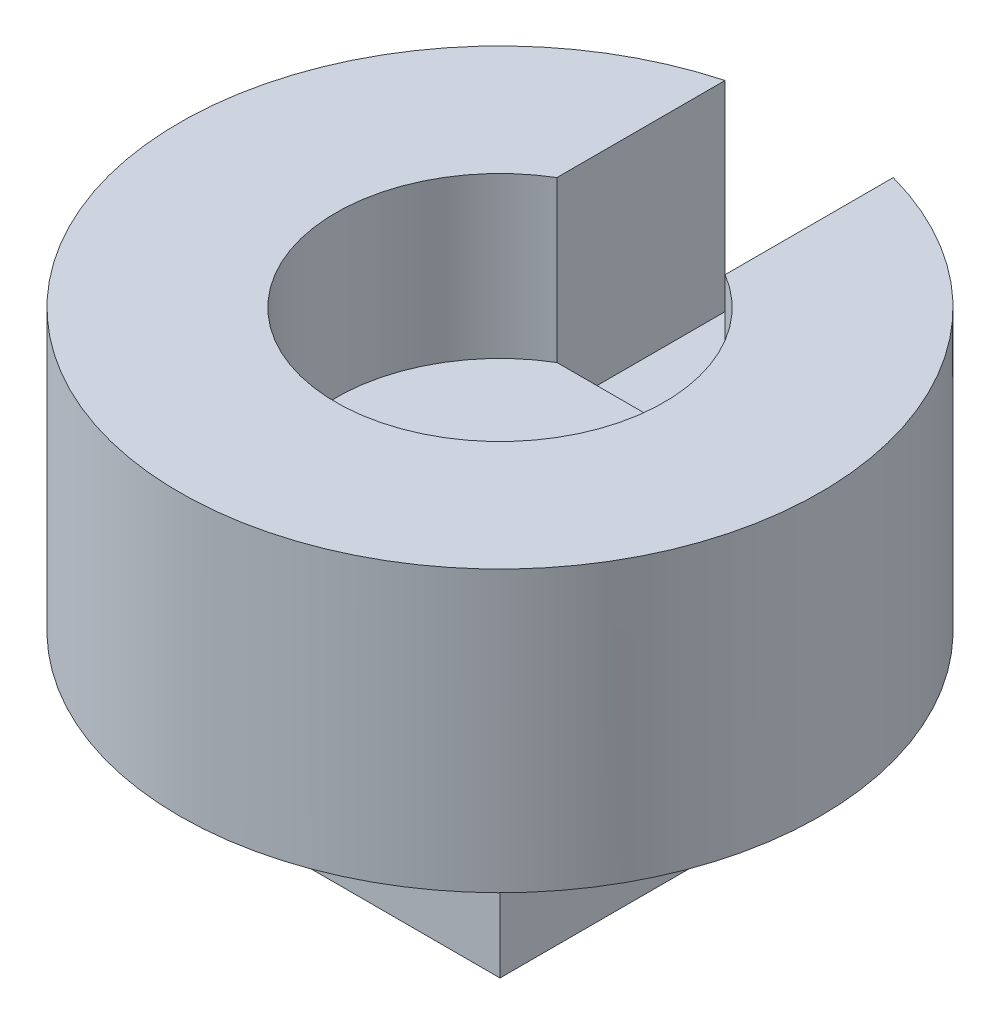
ISO-10303-21;
HEADER;
FILE_DESCRIPTION(('STEP AP214'),'2;1');
FILE_NAME('part.step','',(''),(''),'','','');
FILE_SCHEMA(('AUTOMOTIVE_DESIGN { 1 0 10303 214 1 1 1 1 }'));
ENDSEC;
DATA;
#1=APPLICATION_CONTEXT('core data for automotive mechanical design processes');
#2=APPLICATION_PROTOCOL_DEFINITION('international standard','automotive_design',2000,#1);
#3=PRODUCT_CONTEXT('',#1,'mechanical');
#4=PRODUCT('Part','Part','',(#3));
#5=PRODUCT_RELATED_PRODUCT_CATEGORY('part','',(#4));
#6=PRODUCT_DEFINITION_FORMATION('','',#4);
#7=PRODUCT_DEFINITION_CONTEXT('part definition',#1,'design');
#8=PRODUCT_DEFINITION('design','',#6,#7);
#9=PRODUCT_DEFINITION_SHAPE('','',#8);
#10=(LENGTH_UNIT() NAMED_UNIT(*) SI_UNIT(.MILLI.,.METRE.));
#11=(NAMED_UNIT(*) PLANE_ANGLE_UNIT() SI_UNIT($,.RADIAN.));
#12=(NAMED_UNIT(*) SI_UNIT($,.STERADIAN.) SOLID_ANGLE_UNIT());
#13=UNCERTAINTY_MEASURE_WITH_UNIT(LENGTH_MEASURE(1.E-05),#10,'distance_accuracy_value','');
#14=(GEOMETRIC_REPRESENTATION_CONTEXT(3) GLOBAL_UNCERTAINTY_ASSIGNED_CONTEXT((#13)) GLOBAL_UNIT_ASSIGNED_CONTEXT((#10,
#11,#12)) REPRESENTATION_CONTEXT('',''));
#15=CARTESIAN_POINT('',(0.,0.,0.));
#16=DIRECTION('',(0.,0.,1.));
#17=DIRECTION('',(1.,0.,0.));
#18=AXIS2_PLACEMENT_3D('',#15,#16,#17);
#19=CARTESIAN_POINT('',(0.,6.,0.));
#20=DIRECTION('',(0.,-1.,0.));
#21=DIRECTION('',(0.,0.,-1.));
#22=AXIS2_PLACEMENT_3D('',#19,#20,#21);
#23=CYLINDRICAL_SURFACE('',#22,4.);
#24=DIRECTION('',(0.,1.,0.));
#25=VECTOR('',#24,1.);
#26=CARTESIAN_POINT('',(-1.05,4.,-3.85972796968906));
#27=LINE('',#26,#25);
#28=CARTESIAN_POINT('',(-1.05,3.5,-3.85972796968906));
#29=VERTEX_POINT('',#28);
#30=CARTESIAN_POINT('',(-1.05,6.,-3.85972796968906));
#31=VERTEX_POINT('',#30);
#32=EDGE_CURVE('E163',#29,#31,#27,.T.);
#33=ORIENTED_EDGE('',*,*,#32,.F.);
#34=CARTESIAN_POINT('',(0.,3.5,0.));
#35=DIRECTION('',(0.,1.,0.));
#36=DIRECTION('',(0.,0.,1.));
#37=AXIS2_PLACEMENT_3D('',#34,#35,#36);
#38=CIRCLE('',#37,4.);
#39=CARTESIAN_POINT('',(1.05,3.5,-3.85972796968906));
#40=VERTEX_POINT('',#39);
#41=EDGE_CURVE('E140',#40,#29,#38,.T.);
#42=ORIENTED_EDGE('',*,*,#41,.F.);
#43=DIRECTION('',(0.,1.,0.));
#44=VECTOR('',#43,1.);
#45=CARTESIAN_POINT('',(1.05,4.,-3.85972796968906));
#46=LINE('',#45,#44);
#47=CARTESIAN_POINT('',(1.05,6.,-3.85972796968906));
#48=VERTEX_POINT('',#47);
#49=EDGE_CURVE('E136',#40,#48,#46,.T.);
#50=ORIENTED_EDGE('',*,*,#49,.T.);
#51=CARTESIAN_POINT('',(0.,6.,0.));
#52=DIRECTION('',(0.,1.,0.));
#53=DIRECTION('',(0.,0.,1.));
#54=AXIS2_PLACEMENT_3D('',#51,#52,#53);
#55=CIRCLE('',#54,4.);
#56=EDGE_CURVE('E167',#31,#48,#55,.T.);
#57=ORIENTED_EDGE('',*,*,#56,.F.);
#58=EDGE_LOOP('',(#33,#42,#50,#57));
#59=FACE_BOUND('',#58,.T.);
#60=CARTESIAN_POINT('',(0.,2.5,0.));
#61=DIRECTION('',(0.,1.,0.));
#62=DIRECTION('',(0.,0.,1.));
#63=AXIS2_PLACEMENT_3D('',#60,#61,#62);
#64=CIRCLE('',#63,4.);
#65=CARTESIAN_POINT('',(0.,2.5,4.));
#66=VERTEX_POINT('',#65);
#67=EDGE_CURVE('E162',#66,#66,#64,.T.);
#68=ORIENTED_EDGE('',*,*,#67,.T.);
#69=EDGE_LOOP('',(#68));
#70=FACE_BOUND('',#69,.T.);
#71=ADVANCED_FACE('F38',(#59,#70),#23,.T.);
#72=CARTESIAN_POINT('',(0.,6.,0.));
#73=DIRECTION('',(0.,1.,0.));
#74=DIRECTION('',(0.,0.,1.));
#75=AXIS2_PLACEMENT_3D('',#72,#73,#74);
#76=PLANE('',#75);
#77=CARTESIAN_POINT('',(0.,6.,0.));
#78=DIRECTION('',(0.,1.,0.));
#79=DIRECTION('',(0.,0.,1.));
#80=AXIS2_PLACEMENT_3D('',#77,#78,#79);
#81=CIRCLE('',#80,2.05);
#82=CARTESIAN_POINT('',(-1.05,6.,-1.7606816861659));
#83=VERTEX_POINT('',#82);
#84=CARTESIAN_POINT('',(1.05,6.,-1.7606816861659));
#85=VERTEX_POINT('',#84);
#86=EDGE_CURVE('E53',#83,#85,#81,.T.);
#87=ORIENTED_EDGE('',*,*,#86,.F.);
#88=DIRECTION('',(0.,0.,-1.));
#89=VECTOR('',#88,1.);
#90=CARTESIAN_POINT('',(-1.05,6.,0.));
#91=LINE('',#90,#89);
#92=EDGE_CURVE('E154',#83,#31,#91,.T.);
#93=ORIENTED_EDGE('',*,*,#92,.T.);
#94=ORIENTED_EDGE('',*,*,#56,.T.);
#95=DIRECTION('',(0.,0.,-1.));
#96=VECTOR('',#95,1.);
#97=CARTESIAN_POINT('',(1.05,6.,0.));
#98=LINE('',#97,#96);
#99=EDGE_CURVE('E156',#85,#48,#98,.T.);
#100=ORIENTED_EDGE('',*,*,#99,.F.);
#101=EDGE_LOOP('',(#87,#93,#94,#100));
#102=FACE_BOUND('',#101,.T.);
#103=ADVANCED_FACE('F217',(#102),#76,.T.);
#104=CARTESIAN_POINT('',(1.25,2.5,1.25));
#105=DIRECTION('',(-1.,0.,0.));
#106=DIRECTION('',(0.,0.,1.));
#107=AXIS2_PLACEMENT_3D('',#104,#105,#106);
#108=PLANE('',#107);
#109=DIRECTION('',(0.,0.,-1.));
#110=VECTOR('',#109,1.);
#111=CARTESIAN_POINT('',(1.25,0.,1.25));
#112=LINE('',#111,#110);
#113=CARTESIAN_POINT('',(1.25,0.,1.25));
#114=VERTEX_POINT('',#113);
#115=CARTESIAN_POINT('',(1.25,0.,-1.25));
#116=VERTEX_POINT('',#115);
#117=EDGE_CURVE('E170',#114,#116,#112,.T.);
#118=ORIENTED_EDGE('',*,*,#117,.T.);
#119=DIRECTION('',(0.,-1.,0.));
#120=VECTOR('',#119,1.);
#121=CARTESIAN_POINT('',(1.25,2.5,-1.25));
#122=LINE('',#121,#120);
#123=CARTESIAN_POINT('',(1.25,2.5,-1.25));
#124=VERTEX_POINT('',#123);
#125=EDGE_CURVE('E11',#124,#116,#122,.T.);
#126=ORIENTED_EDGE('',*,*,#125,.F.);
#127=DIRECTION('',(0.,0.,-1.));
#128=VECTOR('',#127,1.);
#129=CARTESIAN_POINT('',(1.25,2.5,1.25));
#130=LINE('',#129,#128);
#131=CARTESIAN_POINT('',(1.25,2.5,1.25));
#132=VERTEX_POINT('',#131);
#133=EDGE_CURVE('E173',#132,#124,#130,.T.);
#134=ORIENTED_EDGE('',*,*,#133,.F.);
#135=DIRECTION('',(0.,-1.,0.));
#136=VECTOR('',#135,1.);
#137=CARTESIAN_POINT('',(1.25,2.5,1.25));
#138=LINE('',#137,#136);
#139=EDGE_CURVE('E183',#132,#114,#138,.T.);
#140=ORIENTED_EDGE('',*,*,#139,.T.);
#141=EDGE_LOOP('',(#118,#126,#134,#140));
#142=FACE_BOUND('',#141,.T.);
#143=ADVANCED_FACE('F40',(#142),#108,.F.);
#144=CARTESIAN_POINT('',(-1.25,2.5,-1.25));
#145=DIRECTION('',(0.,0.,1.));
#146=DIRECTION('',(1.,0.,0.));
#147=AXIS2_PLACEMENT_3D('',#144,#145,#146);
#148=PLANE('',#147);
#149=DIRECTION('',(-1.,0.,0.));
#150=VECTOR('',#149,1.);
#151=CARTESIAN_POINT('',(-1.25,0.,-1.25));
#152=LINE('',#151,#150);
#153=CARTESIAN_POINT('',(-1.25,0.,-1.25));
#154=VERTEX_POINT('',#153);
#155=EDGE_CURVE('E186',#116,#154,#152,.T.);
#156=ORIENTED_EDGE('',*,*,#155,.T.);
#157=DIRECTION('',(0.,-1.,0.));
#158=VECTOR('',#157,1.);
#159=CARTESIAN_POINT('',(-1.25,2.5,-1.25));
#160=LINE('',#159,#158);
#161=CARTESIAN_POINT('',(-1.25,2.5,-1.25));
#162=VERTEX_POINT('',#161);
#163=EDGE_CURVE('E46',#162,#154,#160,.T.);
#164=ORIENTED_EDGE('',*,*,#163,.F.);
#165=DIRECTION('',(-1.,0.,0.));
#166=VECTOR('',#165,1.);
#167=CARTESIAN_POINT('',(-1.25,2.5,-1.25));
#168=LINE('',#167,#166);
#169=EDGE_CURVE('E87',#124,#162,#168,.T.);
#170=ORIENTED_EDGE('',*,*,#169,.F.);
#171=ORIENTED_EDGE('',*,*,#125,.T.);
#172=EDGE_LOOP('',(#156,#164,#170,#171));
#173=FACE_BOUND('',#172,.T.);
#174=ADVANCED_FACE('F228',(#173),#148,.F.);
#175=CARTESIAN_POINT('',(-1.25,2.5,1.25));
#176=DIRECTION('',(1.,0.,0.));
#177=DIRECTION('',(0.,0.,-1.));
#178=AXIS2_PLACEMENT_3D('',#175,#176,#177);
#179=PLANE('',#178);
#180=DIRECTION('',(0.,0.,1.));
#181=VECTOR('',#180,1.);
#182=CARTESIAN_POINT('',(-1.25,0.,1.25));
#183=LINE('',#182,#181);
#184=CARTESIAN_POINT('',(-1.25,0.,1.25));
#185=VERTEX_POINT('',#184);
#186=EDGE_CURVE('E188',#154,#185,#183,.T.);
#187=ORIENTED_EDGE('',*,*,#186,.T.);
#188=DIRECTION('',(0.,-1.,0.));
#189=VECTOR('',#188,1.);
#190=CARTESIAN_POINT('',(-1.25,2.5,1.25));
#191=LINE('',#190,#189);
#192=CARTESIAN_POINT('',(-1.25,2.5,1.25));
#193=VERTEX_POINT('',#192);
#194=EDGE_CURVE('E62',#193,#185,#191,.T.);
#195=ORIENTED_EDGE('',*,*,#194,.F.);
#196=DIRECTION('',(0.,0.,1.));
#197=VECTOR('',#196,1.);
#198=CARTESIAN_POINT('',(-1.25,2.5,1.25));
#199=LINE('',#198,#197);
#200=EDGE_CURVE('E177',#162,#193,#199,.T.);
#201=ORIENTED_EDGE('',*,*,#200,.F.);
#202=ORIENTED_EDGE('',*,*,#163,.T.);
#203=EDGE_LOOP('',(#187,#195,#201,#202));
#204=FACE_BOUND('',#203,.T.);
#205=ADVANCED_FACE('F194',(#204),#179,.F.);
#206=CARTESIAN_POINT('',(-1.25,2.5,1.25));
#207=DIRECTION('',(0.,0.,-1.));
#208=DIRECTION('',(-1.,0.,0.));
#209=AXIS2_PLACEMENT_3D('',#206,#207,#208);
#210=PLANE('',#209);
#211=DIRECTION('',(1.,0.,0.));
#212=VECTOR('',#211,1.);
#213=CARTESIAN_POINT('',(-1.25,0.,1.25));
#214=LINE('',#213,#212);
#215=EDGE_CURVE('E82',#185,#114,#214,.T.);
#216=ORIENTED_EDGE('',*,*,#215,.T.);
#217=ORIENTED_EDGE('',*,*,#139,.F.);
#218=DIRECTION('',(1.,0.,0.));
#219=VECTOR('',#218,1.);
#220=CARTESIAN_POINT('',(-1.25,2.5,1.25));
#221=LINE('',#220,#219);
#222=EDGE_CURVE('E180',#193,#132,#221,.T.);
#223=ORIENTED_EDGE('',*,*,#222,.F.);
#224=ORIENTED_EDGE('',*,*,#194,.T.);
#225=EDGE_LOOP('',(#216,#217,#223,#224));
#226=FACE_BOUND('',#225,.T.);
#227=ADVANCED_FACE('F199',(#226),#210,.F.);
#228=CARTESIAN_POINT('',(0.,0.,0.));
#229=DIRECTION('',(0.,-1.,0.));
#230=DIRECTION('',(0.,0.,-1.));
#231=AXIS2_PLACEMENT_3D('',#228,#229,#230);
#232=PLANE('',#231);
#233=ORIENTED_EDGE('',*,*,#117,.F.);
#234=ORIENTED_EDGE('',*,*,#215,.F.);
#235=ORIENTED_EDGE('',*,*,#186,.F.);
#236=ORIENTED_EDGE('',*,*,#155,.F.);
#237=EDGE_LOOP('',(#233,#234,#235,#236));
#238=FACE_BOUND('',#237,.T.);
#239=ADVANCED_FACE('F197',(#238),#232,.T.);
#240=CARTESIAN_POINT('',(0.,2.5,0.));
#241=DIRECTION('',(0.,1.,0.));
#242=DIRECTION('',(0.,0.,1.));
#243=AXIS2_PLACEMENT_3D('',#240,#241,#242);
#244=PLANE('',#243);
#245=ORIENTED_EDGE('',*,*,#67,.F.);
#246=EDGE_LOOP('',(#245));
#247=FACE_BOUND('',#246,.T.);
#248=ORIENTED_EDGE('',*,*,#222,.T.);
#249=ORIENTED_EDGE('',*,*,#133,.T.);
#250=ORIENTED_EDGE('',*,*,#169,.T.);
#251=ORIENTED_EDGE('',*,*,#200,.T.);
#252=EDGE_LOOP('',(#248,#249,#250,#251));
#253=FACE_BOUND('',#252,.T.);
#254=ADVANCED_FACE('F201',(#247,#253),#244,.F.);
#255=CARTESIAN_POINT('',(0.,4.,0.));
#256=DIRECTION('',(0.,1.,0.));
#257=DIRECTION('',(0.,0.,1.));
#258=AXIS2_PLACEMENT_3D('',#255,#256,#257);
#259=CYLINDRICAL_SURFACE('',#258,2.05);
#260=ORIENTED_EDGE('',*,*,#86,.T.);
#261=DIRECTION('',(0.,1.,0.));
#262=VECTOR('',#261,1.);
#263=CARTESIAN_POINT('',(1.05,4.,-1.7606816861659));
#264=LINE('',#263,#262);
#265=CARTESIAN_POINT('',(1.05,4.,-1.7606816861659));
#266=VERTEX_POINT('',#265);
#267=EDGE_CURVE('E153',#266,#85,#264,.T.);
#268=ORIENTED_EDGE('',*,*,#267,.F.);
#269=CARTESIAN_POINT('',(0.,4.,0.));
#270=DIRECTION('',(0.,1.,0.));
#271=DIRECTION('',(0.,0.,1.));
#272=AXIS2_PLACEMENT_3D('',#269,#270,#271);
#273=CIRCLE('',#272,2.05);
#274=CARTESIAN_POINT('',(-1.05,4.,-1.7606816861659));
#275=VERTEX_POINT('',#274);
#276=EDGE_CURVE('E150',#275,#266,#273,.T.);
#277=ORIENTED_EDGE('',*,*,#276,.F.);
#278=DIRECTION('',(0.,1.,0.));
#279=VECTOR('',#278,1.);
#280=CARTESIAN_POINT('',(-1.05,4.,-1.7606816861659));
#281=LINE('',#280,#279);
#282=EDGE_CURVE('E160',#275,#83,#281,.T.);
#283=ORIENTED_EDGE('',*,*,#282,.T.);
#284=EDGE_LOOP('',(#260,#268,#277,#283));
#285=FACE_BOUND('',#284,.T.);
#286=ADVANCED_FACE('F203',(#285),#259,.F.);
#287=CARTESIAN_POINT('',(-1.05,4.,0.));
#288=DIRECTION('',(1.,0.,0.));
#289=DIRECTION('',(0.,0.,-1.));
#290=AXIS2_PLACEMENT_3D('',#287,#288,#289);
#291=PLANE('',#290);
#292=ORIENTED_EDGE('',*,*,#92,.F.);
#293=ORIENTED_EDGE('',*,*,#282,.F.);
#294=DIRECTION('',(0.,1.,0.));
#295=VECTOR('',#294,1.);
#296=CARTESIAN_POINT('',(-1.05,3.5,-1.7606816861659));
#297=LINE('',#296,#295);
#298=CARTESIAN_POINT('',(-1.05,3.5,-1.7606816861659));
#299=VERTEX_POINT('',#298);
#300=EDGE_CURVE('E129',#299,#275,#297,.T.);
#301=ORIENTED_EDGE('',*,*,#300,.F.);
#302=DIRECTION('',(0.,0.,1.));
#303=VECTOR('',#302,1.);
#304=CARTESIAN_POINT('',(-1.05,3.5,0.));
#305=LINE('',#304,#303);
#306=EDGE_CURVE('E130',#29,#299,#305,.T.);
#307=ORIENTED_EDGE('',*,*,#306,.F.);
#308=ORIENTED_EDGE('',*,*,#32,.T.);
#309=EDGE_LOOP('',(#292,#293,#301,#307,#308));
#310=FACE_BOUND('',#309,.T.);
#311=ADVANCED_FACE('F210',(#310),#291,.T.);
#312=CARTESIAN_POINT('',(1.05,4.,0.));
#313=DIRECTION('',(1.,0.,0.));
#314=DIRECTION('',(0.,0.,-1.));
#315=AXIS2_PLACEMENT_3D('',#312,#313,#314);
#316=PLANE('',#315);
#317=ORIENTED_EDGE('',*,*,#99,.T.);
#318=ORIENTED_EDGE('',*,*,#49,.F.);
#319=DIRECTION('',(0.,0.,-1.));
#320=VECTOR('',#319,1.);
#321=CARTESIAN_POINT('',(1.05,3.5,0.));
#322=LINE('',#321,#320);
#323=CARTESIAN_POINT('',(1.05,3.5,-1.7606816861659));
#324=VERTEX_POINT('',#323);
#325=EDGE_CURVE('E133',#324,#40,#322,.T.);
#326=ORIENTED_EDGE('',*,*,#325,.F.);
#327=DIRECTION('',(0.,1.,0.));
#328=VECTOR('',#327,1.);
#329=CARTESIAN_POINT('',(1.05,3.5,-1.7606816861659));
#330=LINE('',#329,#328);
#331=EDGE_CURVE('E120',#324,#266,#330,.T.);
#332=ORIENTED_EDGE('',*,*,#331,.T.);
#333=ORIENTED_EDGE('',*,*,#267,.T.);
#334=EDGE_LOOP('',(#317,#318,#326,#332,#333));
#335=FACE_BOUND('',#334,.T.);
#336=ADVANCED_FACE('F134',(#335),#316,.F.);
#337=CARTESIAN_POINT('',(0.,4.,0.));
#338=DIRECTION('',(0.,1.,0.));
#339=DIRECTION('',(0.,0.,1.));
#340=AXIS2_PLACEMENT_3D('',#337,#338,#339);
#341=PLANE('',#340);
#342=DIRECTION('',(1.,0.,0.));
#343=VECTOR('',#342,1.);
#344=CARTESIAN_POINT('',(0.,4.,-1.7606816861659));
#345=LINE('',#344,#343);
#346=EDGE_CURVE('E127',#275,#266,#345,.T.);
#347=ORIENTED_EDGE('',*,*,#346,.F.);
#348=ORIENTED_EDGE('',*,*,#276,.T.);
#349=EDGE_LOOP('',(#347,#348));
#350=FACE_BOUND('',#349,.T.);
#351=ADVANCED_FACE('F276',(#350),#341,.T.);
#352=CARTESIAN_POINT('',(0.,3.5,-1.7606816861659));
#353=DIRECTION('',(0.,0.,1.));
#354=DIRECTION('',(1.,0.,0.));
#355=AXIS2_PLACEMENT_3D('',#352,#353,#354);
#356=PLANE('',#355);
#357=ORIENTED_EDGE('',*,*,#346,.T.);
#358=ORIENTED_EDGE('',*,*,#331,.F.);
#359=DIRECTION('',(1.,0.,0.));
#360=VECTOR('',#359,1.);
#361=CARTESIAN_POINT('',(0.,3.5,-1.7606816861659));
#362=LINE('',#361,#360);
#363=EDGE_CURVE('E124',#299,#324,#362,.T.);
#364=ORIENTED_EDGE('',*,*,#363,.F.);
#365=ORIENTED_EDGE('',*,*,#300,.T.);
#366=EDGE_LOOP('',(#357,#358,#364,#365));
#367=FACE_BOUND('',#366,.T.);
#368=ADVANCED_FACE('F122',(#367),#356,.F.);
#369=CARTESIAN_POINT('',(0.,3.5,0.));
#370=DIRECTION('',(0.,1.,0.));
#371=DIRECTION('',(0.,0.,1.));
#372=AXIS2_PLACEMENT_3D('',#369,#370,#371);
#373=PLANE('',#372);
#374=ORIENTED_EDGE('',*,*,#363,.T.);
#375=ORIENTED_EDGE('',*,*,#325,.T.);
#376=ORIENTED_EDGE('',*,*,#41,.T.);
#377=ORIENTED_EDGE('',*,*,#306,.T.);
#378=EDGE_LOOP('',(#374,#375,#376,#377));
#379=FACE_BOUND('',#378,.T.);
#380=ADVANCED_FACE('F142',(#379),#373,.T.);
#381=CLOSED_SHELL('',(#71,#103,#143,#174,#205,#227,#239,#254,#286,#311,#336,#351,#368,#380));
#382=MANIFOLD_SOLID_BREP('B2',#381);
#383=ADVANCED_BREP_SHAPE_REPRESENTATION('',(#18,#382),#14);
#384=SHAPE_DEFINITION_REPRESENTATION(#9,#383);
ENDSEC;
END-ISO-10303-21;
